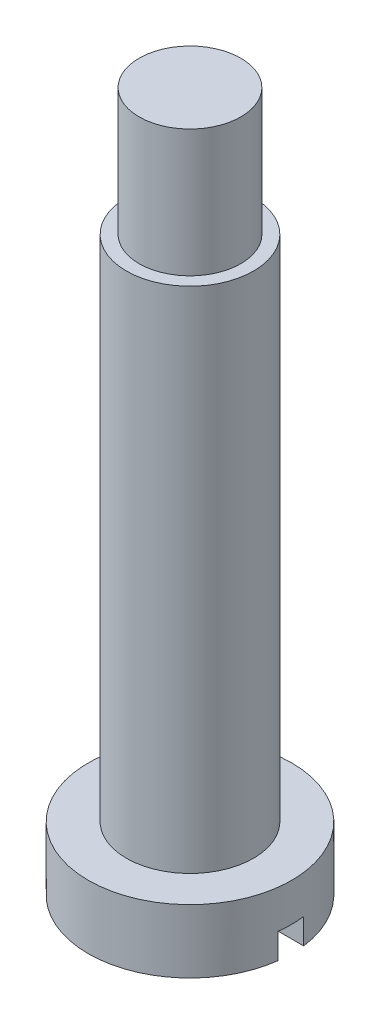
ISO-10303-21;
HEADER;
FILE_DESCRIPTION(('STEP AP214'),'2;1');
FILE_NAME('part.step','',(''),(''),'','','');
FILE_SCHEMA(('AUTOMOTIVE_DESIGN { 1 0 10303 214 1 1 1 1 }'));
ENDSEC;
DATA;
#1=APPLICATION_CONTEXT('core data for automotive mechanical design processes');
#2=APPLICATION_PROTOCOL_DEFINITION('international standard','automotive_design',2000,#1);
#3=PRODUCT_CONTEXT('',#1,'mechanical');
#4=PRODUCT('Part','Part','',(#3));
#5=PRODUCT_RELATED_PRODUCT_CATEGORY('part','',(#4));
#6=PRODUCT_DEFINITION_FORMATION('','',#4);
#7=PRODUCT_DEFINITION_CONTEXT('part definition',#1,'design');
#8=PRODUCT_DEFINITION('design','',#6,#7);
#9=PRODUCT_DEFINITION_SHAPE('','',#8);
#10=(LENGTH_UNIT() NAMED_UNIT(*) SI_UNIT(.MILLI.,.METRE.));
#11=(NAMED_UNIT(*) PLANE_ANGLE_UNIT() SI_UNIT($,.RADIAN.));
#12=(NAMED_UNIT(*) SI_UNIT($,.STERADIAN.) SOLID_ANGLE_UNIT());
#13=UNCERTAINTY_MEASURE_WITH_UNIT(LENGTH_MEASURE(1.E-05),#10,'distance_accuracy_value','');
#14=(GEOMETRIC_REPRESENTATION_CONTEXT(3) GLOBAL_UNCERTAINTY_ASSIGNED_CONTEXT((#13)) GLOBAL_UNIT_ASSIGNED_CONTEXT((#10,
#11,#12)) REPRESENTATION_CONTEXT('',''));
#15=CARTESIAN_POINT('',(0.,0.,0.));
#16=DIRECTION('',(0.,0.,1.));
#17=DIRECTION('',(1.,0.,0.));
#18=AXIS2_PLACEMENT_3D('',#15,#16,#17);
#19=CARTESIAN_POINT('',(0.,-2.5,0.));
#20=DIRECTION('',(0.,1.,0.));
#21=DIRECTION('',(0.,0.,1.));
#22=AXIS2_PLACEMENT_3D('',#19,#20,#21);
#23=CYLINDRICAL_SURFACE('',#22,4.);
#24=CARTESIAN_POINT('',(0.,0.,0.));
#25=DIRECTION('',(0.,1.,0.));
#26=DIRECTION('',(0.,0.,1.));
#27=AXIS2_PLACEMENT_3D('',#24,#25,#26);
#28=CIRCLE('',#27,4.);
#29=CARTESIAN_POINT('',(0.,0.,4.));
#30=VERTEX_POINT('',#29);
#31=EDGE_CURVE('E114',#30,#30,#28,.T.);
#32=ORIENTED_EDGE('',*,*,#31,.F.);
#33=EDGE_LOOP('',(#32));
#34=FACE_BOUND('',#33,.T.);
#35=CARTESIAN_POINT('',(0.,-2.5,0.));
#36=DIRECTION('',(0.,1.,0.));
#37=DIRECTION('',(0.,0.,1.));
#38=AXIS2_PLACEMENT_3D('',#35,#36,#37);
#39=CIRCLE('',#38,4.);
#40=CARTESIAN_POINT('',(3.96862696659689,-2.5,-0.5));
#41=VERTEX_POINT('',#40);
#42=CARTESIAN_POINT('',(-3.96862696659689,-2.5,-0.5));
#43=VERTEX_POINT('',#42);
#44=EDGE_CURVE('E117',#41,#43,#39,.T.);
#45=ORIENTED_EDGE('',*,*,#44,.T.);
#46=DIRECTION('',(0.,1.,0.));
#47=VECTOR('',#46,1.);
#48=CARTESIAN_POINT('',(-3.96862696659689,-2.5,-0.5));
#49=LINE('',#48,#47);
#50=CARTESIAN_POINT('',(-3.96862696659689,-1.5,-0.5));
#51=VERTEX_POINT('',#50);
#52=EDGE_CURVE('E86',#43,#51,#49,.T.);
#53=ORIENTED_EDGE('',*,*,#52,.T.);
#54=CARTESIAN_POINT('',(0.,-1.5,0.));
#55=DIRECTION('',(0.,1.,0.));
#56=DIRECTION('',(0.,0.,1.));
#57=AXIS2_PLACEMENT_3D('',#54,#55,#56);
#58=CIRCLE('',#57,4.);
#59=CARTESIAN_POINT('',(-3.96862696659689,-1.5,0.5));
#60=VERTEX_POINT('',#59);
#61=EDGE_CURVE('E11',#60,#51,#58,.F.);
#62=ORIENTED_EDGE('',*,*,#61,.F.);
#63=DIRECTION('',(0.,1.,0.));
#64=VECTOR('',#63,1.);
#65=CARTESIAN_POINT('',(-3.96862696659689,-2.5,0.5));
#66=LINE('',#65,#64);
#67=CARTESIAN_POINT('',(-3.96862696659689,-2.5,0.5));
#68=VERTEX_POINT('',#67);
#69=EDGE_CURVE('E84',#68,#60,#66,.T.);
#70=ORIENTED_EDGE('',*,*,#69,.F.);
#71=CARTESIAN_POINT('',(3.96862696659689,-2.5,0.5));
#72=VERTEX_POINT('',#71);
#73=EDGE_CURVE('E118',#68,#72,#39,.T.);
#74=ORIENTED_EDGE('',*,*,#73,.T.);
#75=DIRECTION('',(0.,1.,0.));
#76=VECTOR('',#75,1.);
#77=CARTESIAN_POINT('',(3.96862696659689,-2.5,0.5));
#78=LINE('',#77,#76);
#79=CARTESIAN_POINT('',(3.96862696659689,-1.5,0.5));
#80=VERTEX_POINT('',#79);
#81=EDGE_CURVE('E54',#80,#72,#78,.F.);
#82=ORIENTED_EDGE('',*,*,#81,.F.);
#83=CARTESIAN_POINT('',(3.96862696659689,-1.5,-0.5));
#84=VERTEX_POINT('',#83);
#85=EDGE_CURVE('E43',#84,#80,#58,.F.);
#86=ORIENTED_EDGE('',*,*,#85,.F.);
#87=DIRECTION('',(0.,1.,0.));
#88=VECTOR('',#87,1.);
#89=CARTESIAN_POINT('',(3.96862696659689,-2.5,-0.5));
#90=LINE('',#89,#88);
#91=EDGE_CURVE('E102',#84,#41,#90,.F.);
#92=ORIENTED_EDGE('',*,*,#91,.T.);
#93=EDGE_LOOP('',(#45,#53,#62,#70,#74,#82,#86,#92));
#94=FACE_BOUND('',#93,.T.);
#95=ADVANCED_FACE('F40',(#34,#94),#23,.T.);
#96=CARTESIAN_POINT('',(0.,-2.5,0.));
#97=DIRECTION('',(0.,1.,0.));
#98=DIRECTION('',(0.,0.,1.));
#99=AXIS2_PLACEMENT_3D('',#96,#97,#98);
#100=PLANE('',#99);
#101=DIRECTION('',(1.,0.,0.));
#102=VECTOR('',#101,1.);
#103=CARTESIAN_POINT('',(0.,-2.5,-0.5));
#104=LINE('',#103,#102);
#105=EDGE_CURVE('E62',#43,#41,#104,.T.);
#106=ORIENTED_EDGE('',*,*,#105,.F.);
#107=ORIENTED_EDGE('',*,*,#44,.F.);
#108=EDGE_LOOP('',(#106,#107));
#109=FACE_BOUND('',#108,.T.);
#110=ADVANCED_FACE('F127',(#109),#100,.F.);
#111=ORIENTED_EDGE('',*,*,#73,.F.);
#112=DIRECTION('',(1.,0.,0.));
#113=VECTOR('',#112,1.);
#114=CARTESIAN_POINT('',(0.,-2.5,0.5));
#115=LINE('',#114,#113);
#116=EDGE_CURVE('E93',#68,#72,#115,.T.);
#117=ORIENTED_EDGE('',*,*,#116,.T.);
#118=EDGE_LOOP('',(#111,#117));
#119=FACE_BOUND('',#118,.T.);
#120=ADVANCED_FACE('F123',(#119),#100,.F.);
#121=CARTESIAN_POINT('',(0.,0.,0.));
#122=DIRECTION('',(0.,1.,0.));
#123=DIRECTION('',(0.,0.,1.));
#124=AXIS2_PLACEMENT_3D('',#121,#122,#123);
#125=PLANE('',#124);
#126=CARTESIAN_POINT('',(0.,0.,0.));
#127=DIRECTION('',(0.,1.,0.));
#128=DIRECTION('',(0.,0.,1.));
#129=AXIS2_PLACEMENT_3D('',#126,#127,#128);
#130=CIRCLE('',#129,2.5);
#131=CARTESIAN_POINT('',(0.,0.,2.5));
#132=VERTEX_POINT('',#131);
#133=EDGE_CURVE('E111',#132,#132,#130,.T.);
#134=ORIENTED_EDGE('',*,*,#133,.F.);
#135=EDGE_LOOP('',(#134));
#136=FACE_BOUND('',#135,.T.);
#137=ORIENTED_EDGE('',*,*,#31,.T.);
#138=EDGE_LOOP('',(#137));
#139=FACE_BOUND('',#138,.T.);
#140=ADVANCED_FACE('F134',(#136,#139),#125,.T.);
#141=CARTESIAN_POINT('',(0.,20.,0.));
#142=DIRECTION('',(0.,-1.,0.));
#143=DIRECTION('',(0.,0.,-1.));
#144=AXIS2_PLACEMENT_3D('',#141,#142,#143);
#145=CYLINDRICAL_SURFACE('',#144,2.5);
#146=CARTESIAN_POINT('',(0.,20.,0.));
#147=DIRECTION('',(0.,1.,0.));
#148=DIRECTION('',(0.,0.,1.));
#149=AXIS2_PLACEMENT_3D('',#146,#147,#148);
#150=CIRCLE('',#149,2.5);
#151=CARTESIAN_POINT('',(0.,20.,2.5));
#152=VERTEX_POINT('',#151);
#153=EDGE_CURVE('E107',#152,#152,#150,.T.);
#154=ORIENTED_EDGE('',*,*,#153,.F.);
#155=EDGE_LOOP('',(#154));
#156=FACE_BOUND('',#155,.T.);
#157=ORIENTED_EDGE('',*,*,#133,.T.);
#158=EDGE_LOOP('',(#157));
#159=FACE_BOUND('',#158,.T.);
#160=ADVANCED_FACE('F137',(#156,#159),#145,.T.);
#161=CARTESIAN_POINT('',(0.,20.,0.));
#162=DIRECTION('',(0.,1.,0.));
#163=DIRECTION('',(0.,0.,1.));
#164=AXIS2_PLACEMENT_3D('',#161,#162,#163);
#165=PLANE('',#164);
#166=CARTESIAN_POINT('',(0.,20.,0.));
#167=DIRECTION('',(0.,1.,0.));
#168=DIRECTION('',(0.,0.,1.));
#169=AXIS2_PLACEMENT_3D('',#166,#167,#168);
#170=CIRCLE('',#169,2.);
#171=CARTESIAN_POINT('',(0.,20.,2.));
#172=VERTEX_POINT('',#171);
#173=EDGE_CURVE('E108',#172,#172,#170,.T.);
#174=ORIENTED_EDGE('',*,*,#173,.F.);
#175=EDGE_LOOP('',(#174));
#176=FACE_BOUND('',#175,.T.);
#177=ORIENTED_EDGE('',*,*,#153,.T.);
#178=EDGE_LOOP('',(#177));
#179=FACE_BOUND('',#178,.T.);
#180=ADVANCED_FACE('F144',(#176,#179),#165,.T.);
#181=CARTESIAN_POINT('',(0.,25.,0.));
#182=DIRECTION('',(0.,-1.,0.));
#183=DIRECTION('',(0.,0.,-1.));
#184=AXIS2_PLACEMENT_3D('',#181,#182,#183);
#185=CYLINDRICAL_SURFACE('',#184,2.);
#186=CARTESIAN_POINT('',(0.,25.,0.));
#187=DIRECTION('',(0.,1.,0.));
#188=DIRECTION('',(0.,0.,1.));
#189=AXIS2_PLACEMENT_3D('',#186,#187,#188);
#190=CIRCLE('',#189,2.);
#191=CARTESIAN_POINT('',(0.,25.,2.));
#192=VERTEX_POINT('',#191);
#193=EDGE_CURVE('E104',#192,#192,#190,.T.);
#194=ORIENTED_EDGE('',*,*,#193,.F.);
#195=EDGE_LOOP('',(#194));
#196=FACE_BOUND('',#195,.T.);
#197=ORIENTED_EDGE('',*,*,#173,.T.);
#198=EDGE_LOOP('',(#197));
#199=FACE_BOUND('',#198,.T.);
#200=ADVANCED_FACE('F153',(#196,#199),#185,.T.);
#201=CARTESIAN_POINT('',(0.,25.,0.));
#202=DIRECTION('',(0.,1.,0.));
#203=DIRECTION('',(0.,0.,1.));
#204=AXIS2_PLACEMENT_3D('',#201,#202,#203);
#205=PLANE('',#204);
#206=ORIENTED_EDGE('',*,*,#193,.T.);
#207=EDGE_LOOP('',(#206));
#208=FACE_BOUND('',#207,.T.);
#209=ADVANCED_FACE('F160',(#208),#205,.T.);
#210=CARTESIAN_POINT('',(-4.,-2.500012,-0.5));
#211=DIRECTION('',(0.,0.,1.));
#212=DIRECTION('',(1.,0.,0.));
#213=AXIS2_PLACEMENT_3D('',#210,#211,#212);
#214=PLANE('',#213);
#215=DIRECTION('',(1.,0.,0.));
#216=VECTOR('',#215,1.);
#217=CARTESIAN_POINT('',(-4.,-1.5,-0.5));
#218=LINE('',#217,#216);
#219=EDGE_CURVE('E96',#51,#84,#218,.T.);
#220=ORIENTED_EDGE('',*,*,#219,.F.);
#221=ORIENTED_EDGE('',*,*,#52,.F.);
#222=ORIENTED_EDGE('',*,*,#105,.T.);
#223=ORIENTED_EDGE('',*,*,#91,.F.);
#224=EDGE_LOOP('',(#220,#221,#222,#223));
#225=FACE_BOUND('',#224,.T.);
#226=ADVANCED_FACE('F125',(#225),#214,.T.);
#227=CARTESIAN_POINT('',(-4.,-2.500012,0.5));
#228=DIRECTION('',(0.,0.,1.));
#229=DIRECTION('',(1.,0.,0.));
#230=AXIS2_PLACEMENT_3D('',#227,#228,#229);
#231=PLANE('',#230);
#232=ORIENTED_EDGE('',*,*,#81,.T.);
#233=ORIENTED_EDGE('',*,*,#116,.F.);
#234=ORIENTED_EDGE('',*,*,#69,.T.);
#235=DIRECTION('',(1.,0.,0.));
#236=VECTOR('',#235,1.);
#237=CARTESIAN_POINT('',(-4.,-1.5,0.5));
#238=LINE('',#237,#236);
#239=EDGE_CURVE('E92',#60,#80,#238,.T.);
#240=ORIENTED_EDGE('',*,*,#239,.T.);
#241=EDGE_LOOP('',(#232,#233,#234,#240));
#242=FACE_BOUND('',#241,.T.);
#243=ADVANCED_FACE('F91',(#242),#231,.F.);
#244=CARTESIAN_POINT('',(0.,-1.5,0.));
#245=DIRECTION('',(0.,1.,0.));
#246=DIRECTION('',(-1.,0.,0.));
#247=AXIS2_PLACEMENT_3D('',#244,#245,#246);
#248=PLANE('',#247);
#249=ORIENTED_EDGE('',*,*,#239,.F.);
#250=ORIENTED_EDGE('',*,*,#61,.T.);
#251=ORIENTED_EDGE('',*,*,#219,.T.);
#252=ORIENTED_EDGE('',*,*,#85,.T.);
#253=EDGE_LOOP('',(#249,#250,#251,#252));
#254=FACE_BOUND('',#253,.T.);
#255=ADVANCED_FACE('F95',(#254),#248,.F.);
#256=CLOSED_SHELL('',(#95,#110,#120,#140,#160,#180,#200,#209,#226,#243,#255));
#257=MANIFOLD_SOLID_BREP('B2',#256);
#258=ADVANCED_BREP_SHAPE_REPRESENTATION('',(#18,#257),#14);
#259=SHAPE_DEFINITION_REPRESENTATION(#9,#258);
ENDSEC;
END-ISO-10303-21;
